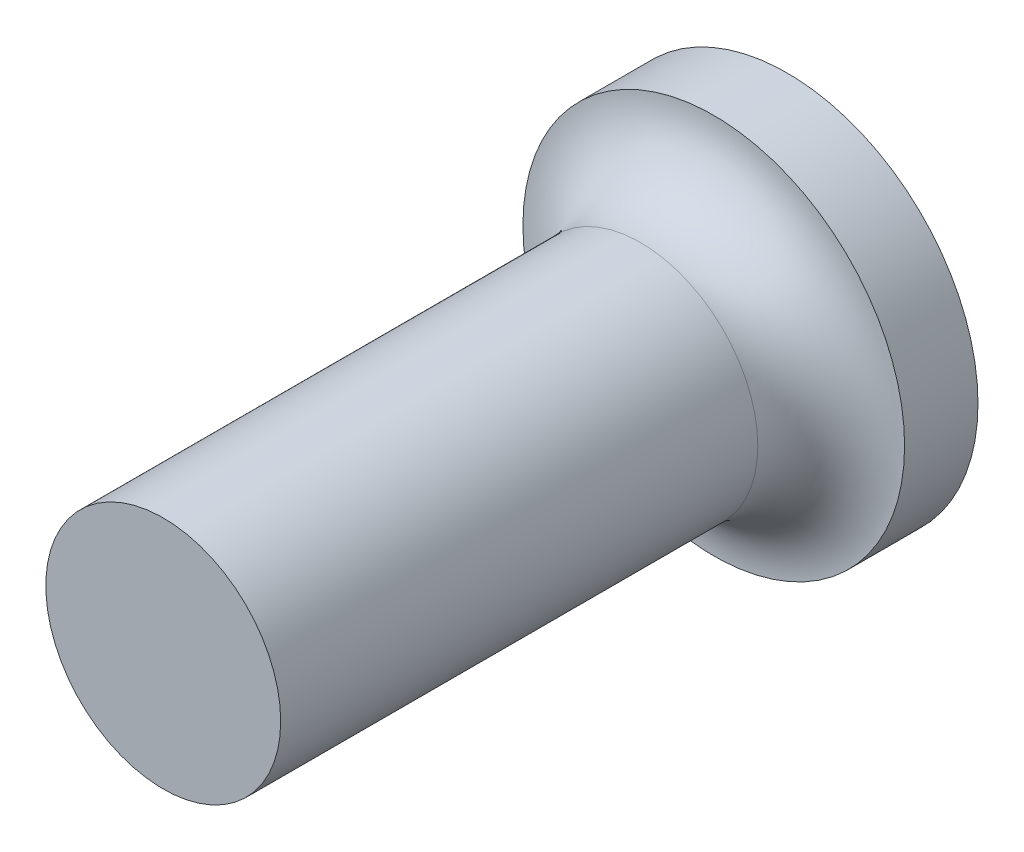
ISO-10303-21;
HEADER;
FILE_DESCRIPTION(('STEP AP214'),'2;1');
FILE_NAME('part.step','',(''),(''),'','','');
FILE_SCHEMA(('AUTOMOTIVE_DESIGN { 1 0 10303 214 1 1 1 1 }'));
ENDSEC;
DATA;
#1=APPLICATION_CONTEXT('core data for automotive mechanical design processes');
#2=APPLICATION_PROTOCOL_DEFINITION('international standard','automotive_design',2000,#1);
#3=PRODUCT_CONTEXT('',#1,'mechanical');
#4=PRODUCT('Part','Part','',(#3));
#5=PRODUCT_RELATED_PRODUCT_CATEGORY('part','',(#4));
#6=PRODUCT_DEFINITION_FORMATION('','',#4);
#7=PRODUCT_DEFINITION_CONTEXT('part definition',#1,'design');
#8=PRODUCT_DEFINITION('design','',#6,#7);
#9=PRODUCT_DEFINITION_SHAPE('','',#8);
#10=(LENGTH_UNIT() NAMED_UNIT(*) SI_UNIT(.MILLI.,.METRE.));
#11=(NAMED_UNIT(*) PLANE_ANGLE_UNIT() SI_UNIT($,.RADIAN.));
#12=(NAMED_UNIT(*) SI_UNIT($,.STERADIAN.) SOLID_ANGLE_UNIT());
#13=UNCERTAINTY_MEASURE_WITH_UNIT(LENGTH_MEASURE(1.E-05),#10,'distance_accuracy_value','');
#14=(GEOMETRIC_REPRESENTATION_CONTEXT(3) GLOBAL_UNCERTAINTY_ASSIGNED_CONTEXT((#13)) GLOBAL_UNIT_ASSIGNED_CONTEXT((#10,
#11,#12)) REPRESENTATION_CONTEXT('',''));
#15=CARTESIAN_POINT('',(0.,0.,0.));
#16=DIRECTION('',(0.,0.,1.));
#17=DIRECTION('',(1.,0.,0.));
#18=AXIS2_PLACEMENT_3D('',#15,#16,#17);
#19=CARTESIAN_POINT('',(0.,0.,8.5));
#20=DIRECTION('',(0.,0.,-1.));
#21=DIRECTION('',(-1.,0.,0.));
#22=AXIS2_PLACEMENT_3D('',#19,#20,#21);
#23=CYLINDRICAL_SURFACE('',#22,1.6);
#24=CARTESIAN_POINT('',(0.,0.,2.));
#25=DIRECTION('',(0.,0.,1.));
#26=DIRECTION('',(1.,0.,0.));
#27=AXIS2_PLACEMENT_3D('',#24,#25,#26);
#28=CIRCLE('',#27,1.6);
#29=CARTESIAN_POINT('',(1.6,0.,2.));
#30=VERTEX_POINT('',#29);
#31=EDGE_CURVE('E10',#30,#30,#28,.T.);
#32=ORIENTED_EDGE('',*,*,#31,.T.);
#33=EDGE_LOOP('',(#32));
#34=FACE_BOUND('',#33,.T.);
#35=CARTESIAN_POINT('',(0.,0.,8.5));
#36=DIRECTION('',(0.,0.,1.));
#37=DIRECTION('',(1.,0.,0.));
#38=AXIS2_PLACEMENT_3D('',#35,#36,#37);
#39=CIRCLE('',#38,1.6);
#40=CARTESIAN_POINT('',(1.6,0.,8.5));
#41=VERTEX_POINT('',#40);
#42=EDGE_CURVE('E40',#41,#41,#39,.T.);
#43=ORIENTED_EDGE('',*,*,#42,.F.);
#44=EDGE_LOOP('',(#43));
#45=FACE_BOUND('',#44,.T.);
#46=ADVANCED_FACE('F33',(#34,#45),#23,.T.);
#47=CARTESIAN_POINT('',(0.,0.,8.5));
#48=DIRECTION('',(0.,0.,1.));
#49=DIRECTION('',(1.,0.,0.));
#50=AXIS2_PLACEMENT_3D('',#47,#48,#49);
#51=PLANE('',#50);
#52=ORIENTED_EDGE('',*,*,#42,.T.);
#53=EDGE_LOOP('',(#52));
#54=FACE_BOUND('',#53,.T.);
#55=ADVANCED_FACE('F64',(#54),#51,.T.);
#56=CARTESIAN_POINT('',(0.,0.,1.));
#57=DIRECTION('',(0.,0.,-1.));
#58=DIRECTION('',(-1.,0.,0.));
#59=AXIS2_PLACEMENT_3D('',#56,#57,#58);
#60=CYLINDRICAL_SURFACE('',#59,2.6);
#61=CARTESIAN_POINT('',(0.,0.,1.));
#62=DIRECTION('',(0.,0.,1.));
#63=DIRECTION('',(1.,0.,0.));
#64=AXIS2_PLACEMENT_3D('',#61,#62,#63);
#65=CIRCLE('',#64,2.6);
#66=CARTESIAN_POINT('',(2.6,0.,1.));
#67=VERTEX_POINT('',#66);
#68=EDGE_CURVE('E44',#67,#67,#65,.T.);
#69=ORIENTED_EDGE('',*,*,#68,.F.);
#70=EDGE_LOOP('',(#69));
#71=FACE_BOUND('',#70,.T.);
#72=CARTESIAN_POINT('',(0.,0.,0.));
#73=DIRECTION('',(0.,0.,1.));
#74=DIRECTION('',(1.,0.,0.));
#75=AXIS2_PLACEMENT_3D('',#72,#73,#74);
#76=CIRCLE('',#75,2.6);
#77=CARTESIAN_POINT('',(2.6,0.,0.));
#78=VERTEX_POINT('',#77);
#79=EDGE_CURVE('E48',#78,#78,#76,.T.);
#80=ORIENTED_EDGE('',*,*,#79,.T.);
#81=EDGE_LOOP('',(#80));
#82=FACE_BOUND('',#81,.T.);
#83=ADVANCED_FACE('F54',(#71,#82),#60,.T.);
#84=CARTESIAN_POINT('',(0.,0.,0.));
#85=DIRECTION('',(0.,0.,1.));
#86=DIRECTION('',(1.,0.,0.));
#87=AXIS2_PLACEMENT_3D('',#84,#85,#86);
#88=PLANE('',#87);
#89=ORIENTED_EDGE('',*,*,#79,.F.);
#90=EDGE_LOOP('',(#89));
#91=FACE_BOUND('',#90,.T.);
#92=ADVANCED_FACE('F56',(#91),#88,.F.);
#93=CARTESIAN_POINT('',(0.,0.,2.));
#94=DIRECTION('',(0.,0.,1.));
#95=DIRECTION('',(1.,0.,0.));
#96=AXIS2_PLACEMENT_3D('',#93,#94,#95);
#97=TOROIDAL_SURFACE('',#96,2.6,1.);
#98=ORIENTED_EDGE('',*,*,#68,.T.);
#99=EDGE_LOOP('',(#98));
#100=FACE_BOUND('',#99,.T.);
#101=ORIENTED_EDGE('',*,*,#31,.F.);
#102=EDGE_LOOP('',(#101));
#103=FACE_BOUND('',#102,.T.);
#104=ADVANCED_FACE('F35',(#100,#103),#97,.F.);
#105=CLOSED_SHELL('',(#46,#55,#83,#92,#104));
#106=MANIFOLD_SOLID_BREP('B2',#105);
#107=ADVANCED_BREP_SHAPE_REPRESENTATION('',(#18,#106),#14);
#108=SHAPE_DEFINITION_REPRESENTATION(#9,#107);
ENDSEC;
END-ISO-10303-21;
